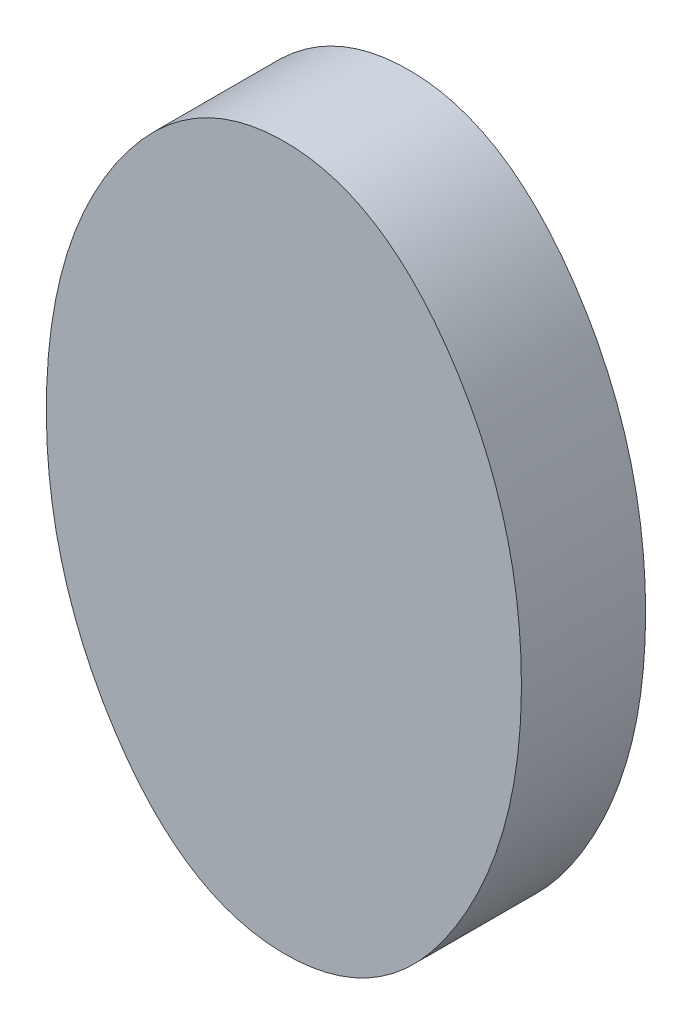
ISO-10303-21;
HEADER;
FILE_DESCRIPTION(('STEP AP214'),'2;1');
FILE_NAME('part.step','',(''),(''),'','','');
FILE_SCHEMA(('AUTOMOTIVE_DESIGN { 1 0 10303 214 1 1 1 1 }'));
ENDSEC;
DATA;
#1=APPLICATION_CONTEXT('core data for automotive mechanical design processes');
#2=APPLICATION_PROTOCOL_DEFINITION('international standard','automotive_design',2000,#1);
#3=PRODUCT_CONTEXT('',#1,'mechanical');
#4=PRODUCT('Part','Part','',(#3));
#5=PRODUCT_RELATED_PRODUCT_CATEGORY('part','',(#4));
#6=PRODUCT_DEFINITION_FORMATION('','',#4);
#7=PRODUCT_DEFINITION_CONTEXT('part definition',#1,'design');
#8=PRODUCT_DEFINITION('design','',#6,#7);
#9=PRODUCT_DEFINITION_SHAPE('','',#8);
#10=(LENGTH_UNIT() NAMED_UNIT(*) SI_UNIT(.MILLI.,.METRE.));
#11=(NAMED_UNIT(*) PLANE_ANGLE_UNIT() SI_UNIT($,.RADIAN.));
#12=(NAMED_UNIT(*) SI_UNIT($,.STERADIAN.) SOLID_ANGLE_UNIT());
#13=UNCERTAINTY_MEASURE_WITH_UNIT(LENGTH_MEASURE(1.E-05),#10,'distance_accuracy_value','');
#14=(GEOMETRIC_REPRESENTATION_CONTEXT(3) GLOBAL_UNCERTAINTY_ASSIGNED_CONTEXT((#13)) GLOBAL_UNIT_ASSIGNED_CONTEXT((#10,
#11,#12)) REPRESENTATION_CONTEXT('',''));
#15=CARTESIAN_POINT('',(0.,0.,0.));
#16=DIRECTION('',(0.,0.,1.));
#17=DIRECTION('',(1.,0.,0.));
#18=AXIS2_PLACEMENT_3D('',#15,#16,#17);
#19=CARTESIAN_POINT('',(-8.95983005625009,-22.7704584365744,333.160489148867));
#20=DIRECTION('',(0.,0.,1.));
#21=DIRECTION('',(1.,0.,0.));
#22=AXIS2_PLACEMENT_3D('',#19,#20,#21);
#23=PLANE('',#22);
#24=CARTESIAN_POINT('',(-6.23796388874143,20.0291224857606,333.160489148867));
#25=CARTESIAN_POINT('',(-6.23796388874143,19.8045130153932,333.160489148867));
#26=CARTESIAN_POINT('',(-6.29248894750601,19.6067591505351,333.160489148867));
#27=CARTESIAN_POINT('',(-6.51058733234495,19.2649622818269,333.160489148867));
#28=CARTESIAN_POINT('',(-6.64649278888791,19.1795131107606,333.160489148867));
#29=CARTESIAN_POINT('',(-6.96875841388791,19.1795131107606,333.160489148867));
#30=CARTESIAN_POINT('',(-7.10466304183794,19.2649623249706,333.160489148867));
#31=CARTESIAN_POINT('',(-7.32927248249143,19.6067591091432,333.160489148867));
#32=CARTESIAN_POINT('',(-7.38542482624143,19.8045130153932,333.160489148867));
#33=CARTESIAN_POINT('',(-7.38542482624143,20.2634974857606,333.160489148867));
#34=CARTESIAN_POINT('',(-7.32927261527016,20.4636927927141,333.160489148867));
#35=CARTESIAN_POINT('',(-7.10466310749143,20.7957238575258,333.160489148867));
#36=CARTESIAN_POINT('',(-6.96875841388791,20.8787318607606,333.160489148867));
#37=CARTESIAN_POINT('',(-6.65300295124143,20.8787318607606,333.160489148867));
#38=CARTESIAN_POINT('',(-6.51872564050324,20.7945033231278,333.160489148867));
#39=CARTESIAN_POINT('',(-6.29411623249143,20.4575892826356,333.160489148867));
#40=CARTESIAN_POINT('',(-6.23796388874143,20.2586145778932,333.160489148867));
#41=CARTESIAN_POINT('',(-6.23796388874143,20.0291224857606,333.160489148867));
#42=(BOUNDED_CURVE() B_SPLINE_CURVE(3,(#24,#25,#26,#27,#28,#29,#30,#31,#32,#33,#34,#35,#36,#37,
#38,#39,#40,#41),.UNSPECIFIED.,.T.,.F.) B_SPLINE_CURVE_WITH_KNOTS((4,2,2,2,2,2,2,2,4),(0.,
0.124864100024788,0.249728274325215,0.372095551438777,0.494462757016289,0.622150221664653,
0.749837535347291,0.874918786057372,1.),
.UNSPECIFIED.) CURVE() GEOMETRIC_REPRESENTATION_ITEM() RATIONAL_B_SPLINE_CURVE((1.,1.,1.,1.,1.,
1.,1.,1.,1.,1.,1.,1.,1.,1.,1.,1.,1.,1.)) REPRESENTATION_ITEM(''));
#43=CARTESIAN_POINT('',(-6.23796388874143,20.0291224857606,333.160489148867));
#44=VERTEX_POINT('',#43);
#45=EDGE_CURVE('E11',#44,#44,#42,.T.);
#46=ORIENTED_EDGE('',*,*,#45,.T.);
#47=EDGE_LOOP('',(#46));
#48=FACE_BOUND('',#47,.T.);
#49=ADVANCED_FACE('F42',(#48),#23,.F.);
#50=CARTESIAN_POINT('',(-6.23796388874143,20.0291224857606,332.960489148867));
#51=CARTESIAN_POINT('',(-6.23796388874143,19.8045130153932,332.960489148867));
#52=CARTESIAN_POINT('',(-6.29248894750601,19.6067591505351,332.960489148867));
#53=CARTESIAN_POINT('',(-6.51058733234495,19.2649622818269,332.960489148867));
#54=CARTESIAN_POINT('',(-6.64649278888791,19.1795131107606,332.960489148867));
#55=CARTESIAN_POINT('',(-6.96875841388791,19.1795131107606,332.960489148867));
#56=CARTESIAN_POINT('',(-7.10466304183794,19.2649623249706,332.960489148867));
#57=CARTESIAN_POINT('',(-7.32927248249143,19.6067591091432,332.960489148867));
#58=CARTESIAN_POINT('',(-7.38542482624143,19.8045130153932,332.960489148867));
#59=CARTESIAN_POINT('',(-7.38542482624143,20.2634974857606,332.960489148867));
#60=CARTESIAN_POINT('',(-7.32927261527016,20.4636927927141,332.960489148867));
#61=CARTESIAN_POINT('',(-7.10466310749143,20.7957238575258,332.960489148867));
#62=CARTESIAN_POINT('',(-6.96875841388791,20.8787318607606,332.960489148867));
#63=CARTESIAN_POINT('',(-6.65300295124143,20.8787318607606,332.960489148867));
#64=CARTESIAN_POINT('',(-6.51872564050324,20.7945033231278,332.960489148867));
#65=CARTESIAN_POINT('',(-6.29411623249143,20.4575892826356,332.960489148867));
#66=CARTESIAN_POINT('',(-6.23796388874143,20.2586145778932,332.960489148867));
#67=CARTESIAN_POINT('',(-6.23796388874143,20.0291224857606,332.960489148867));
#68=(BOUNDED_CURVE() B_SPLINE_CURVE(3,(#50,#51,#52,#53,#54,#55,#56,#57,#58,#59,#60,#61,#62,#63,
#64,#65,#66,#67),.UNSPECIFIED.,.T.,.F.) B_SPLINE_CURVE_WITH_KNOTS((4,2,2,2,2,2,2,2,4),(0.,
0.124864100024788,0.249728274325215,0.372095551438777,0.494462757016289,0.622150221664653,
0.749837535347291,0.874918786057372,1.),
.UNSPECIFIED.) CURVE() GEOMETRIC_REPRESENTATION_ITEM() RATIONAL_B_SPLINE_CURVE((1.,1.,1.,1.,1.,
1.,1.,1.,1.,1.,1.,1.,1.,1.,1.,1.,1.,1.)) REPRESENTATION_ITEM(''));
#69=DIRECTION('',(0.,0.,1.));
#70=VECTOR('',#69,1.);
#71=SURFACE_OF_LINEAR_EXTRUSION('',#68,#70);
#72=ORIENTED_EDGE('',*,*,#45,.F.);
#73=EDGE_LOOP('',(#72));
#74=FACE_BOUND('',#73,.T.);
#75=CARTESIAN_POINT('',(-6.23796388874143,20.0291224857606,333.460489148867));
#76=CARTESIAN_POINT('',(-6.23796388874143,20.2586145778932,333.460489148867));
#77=CARTESIAN_POINT('',(-6.29411623249143,20.4575892826356,333.460489148867));
#78=CARTESIAN_POINT('',(-6.51872564050324,20.7945033231278,333.460489148867));
#79=CARTESIAN_POINT('',(-6.65300295124143,20.8787318607606,333.460489148867));
#80=CARTESIAN_POINT('',(-6.96875841388791,20.8787318607606,333.460489148867));
#81=CARTESIAN_POINT('',(-7.10466310749143,20.7957238575258,333.460489148867));
#82=CARTESIAN_POINT('',(-7.32927261527016,20.4636927927141,333.460489148867));
#83=CARTESIAN_POINT('',(-7.38542482624143,20.2634974857606,333.460489148867));
#84=CARTESIAN_POINT('',(-7.38542482624143,19.8045130153932,333.460489148867));
#85=CARTESIAN_POINT('',(-7.32927248249143,19.6067591091432,333.460489148867));
#86=CARTESIAN_POINT('',(-7.10466304183794,19.2649623249706,333.460489148867));
#87=CARTESIAN_POINT('',(-6.96875841388791,19.1795131107606,333.460489148867));
#88=CARTESIAN_POINT('',(-6.64649278888791,19.1795131107606,333.460489148867));
#89=CARTESIAN_POINT('',(-6.51058733234495,19.2649622818269,333.460489148867));
#90=CARTESIAN_POINT('',(-6.29248894750601,19.6067591505351,333.460489148867));
#91=CARTESIAN_POINT('',(-6.23796388874143,19.8045130153932,333.460489148867));
#92=CARTESIAN_POINT('',(-6.23796388874143,20.0291224857606,333.460489148867));
#93=(BOUNDED_CURVE() B_SPLINE_CURVE(3,(#75,#76,#77,#78,#79,#80,#81,#82,#83,#84,#85,#86,#87,#88,
#89,#90,#91,#92),.UNSPECIFIED.,.T.,.F.) B_SPLINE_CURVE_WITH_KNOTS((4,2,2,2,2,2,2,2,4),(0.,
0.125081213942628,0.250162464652709,0.377849778335347,0.505537242983711,0.627904448561223,
0.750271725674785,0.875135899975212,1.),
.UNSPECIFIED.) CURVE() GEOMETRIC_REPRESENTATION_ITEM() RATIONAL_B_SPLINE_CURVE((1.,1.,1.,1.,1.,
1.,1.,1.,1.,1.,1.,1.,1.,1.,1.,1.,1.,1.)) REPRESENTATION_ITEM(''));
#94=CARTESIAN_POINT('',(-6.23796388874143,20.0291224857606,333.460489148867));
#95=VERTEX_POINT('',#94);
#96=EDGE_CURVE('E54',#95,#95,#93,.T.);
#97=ORIENTED_EDGE('',*,*,#96,.F.);
#98=EDGE_LOOP('',(#97));
#99=FACE_BOUND('',#98,.T.);
#100=ADVANCED_FACE('F44',(#74,#99),#71,.F.);
#101=CARTESIAN_POINT('',(-7.38510803089315,20.059421087907,333.460489148867));
#102=DIRECTION('',(0.,0.,-1.));
#103=DIRECTION('',(0.,-1.,0.));
#104=AXIS2_PLACEMENT_3D('',#101,#102,#103);
#105=PLANE('',#104);
#106=ORIENTED_EDGE('',*,*,#96,.T.);
#107=EDGE_LOOP('',(#106));
#108=FACE_BOUND('',#107,.T.);
#109=ADVANCED_FACE('F67',(#108),#105,.F.);
#110=CLOSED_SHELL('',(#49,#100,#109));
#111=MANIFOLD_SOLID_BREP('B2',#110);
#112=ADVANCED_BREP_SHAPE_REPRESENTATION('',(#18,#111),#14);
#113=SHAPE_DEFINITION_REPRESENTATION(#9,#112);
ENDSEC;
END-ISO-10303-21;
